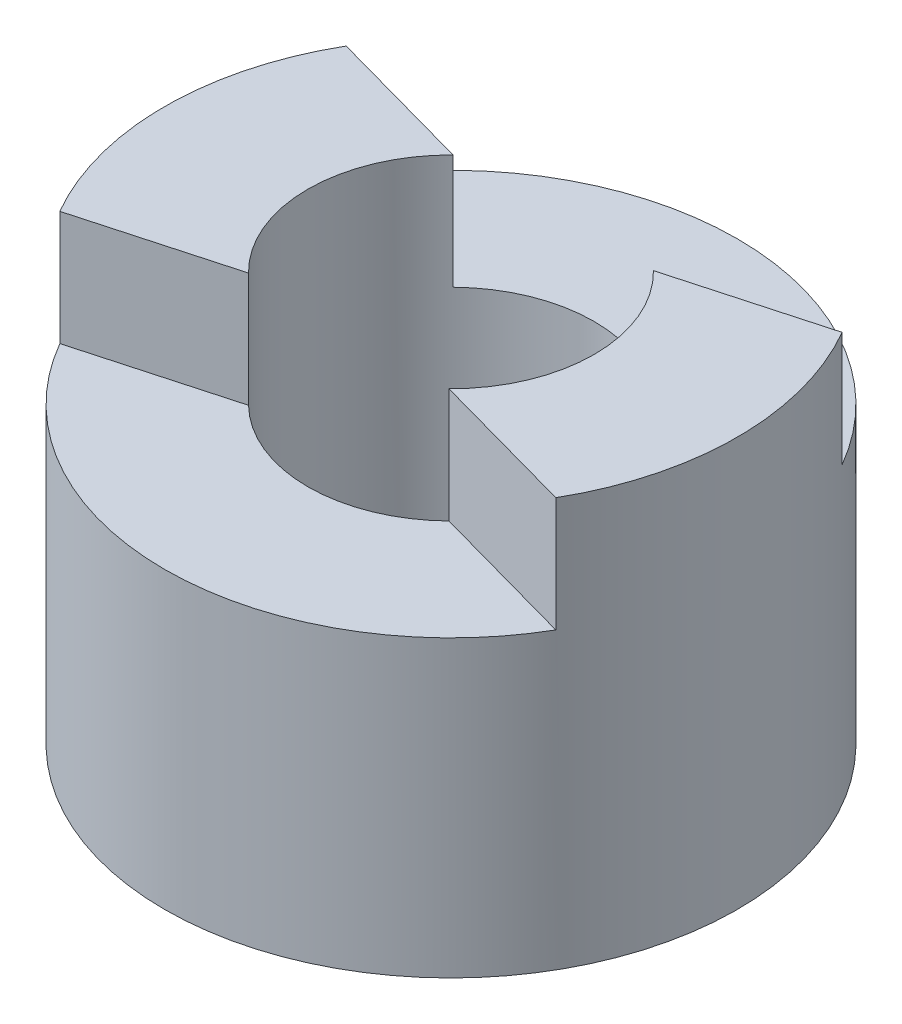
ISO-10303-21;
HEADER;
FILE_DESCRIPTION(('STEP AP214'),'2;1');
FILE_NAME('part.step','',(''),(''),'','','');
FILE_SCHEMA(('AUTOMOTIVE_DESIGN { 1 0 10303 214 1 1 1 1 }'));
ENDSEC;
DATA;
#1=APPLICATION_CONTEXT('core data for automotive mechanical design processes');
#2=APPLICATION_PROTOCOL_DEFINITION('international standard','automotive_design',2000,#1);
#3=PRODUCT_CONTEXT('',#1,'mechanical');
#4=PRODUCT('Part','Part','',(#3));
#5=PRODUCT_RELATED_PRODUCT_CATEGORY('part','',(#4));
#6=PRODUCT_DEFINITION_FORMATION('','',#4);
#7=PRODUCT_DEFINITION_CONTEXT('part definition',#1,'design');
#8=PRODUCT_DEFINITION('design','',#6,#7);
#9=PRODUCT_DEFINITION_SHAPE('','',#8);
#10=(LENGTH_UNIT() NAMED_UNIT(*) SI_UNIT(.MILLI.,.METRE.));
#11=(NAMED_UNIT(*) PLANE_ANGLE_UNIT() SI_UNIT($,.RADIAN.));
#12=(NAMED_UNIT(*) SI_UNIT($,.STERADIAN.) SOLID_ANGLE_UNIT());
#13=UNCERTAINTY_MEASURE_WITH_UNIT(LENGTH_MEASURE(1.E-05),#10,'distance_accuracy_value','');
#14=(GEOMETRIC_REPRESENTATION_CONTEXT(3) GLOBAL_UNCERTAINTY_ASSIGNED_CONTEXT((#13)) GLOBAL_UNIT_ASSIGNED_CONTEXT((#10,
#11,#12)) REPRESENTATION_CONTEXT('',''));
#15=CARTESIAN_POINT('',(0.,0.,0.));
#16=DIRECTION('',(0.,0.,1.));
#17=DIRECTION('',(1.,0.,0.));
#18=AXIS2_PLACEMENT_3D('',#15,#16,#17);
#19=CARTESIAN_POINT('',(0.,50.,0.));
#20=DIRECTION('',(0.,1.,0.));
#21=DIRECTION('',(0.,0.,1.));
#22=AXIS2_PLACEMENT_3D('',#19,#20,#21);
#23=PLANE('',#22);
#24=CARTESIAN_POINT('',(0.,50.,0.));
#25=DIRECTION('',(0.,1.,0.));
#26=DIRECTION('',(0.,0.,1.));
#27=AXIS2_PLACEMENT_3D('',#24,#25,#26);
#28=CIRCLE('',#27,17.5);
#29=CARTESIAN_POINT('',(-12.2474487139159,50.,-12.5));
#30=VERTEX_POINT('',#29);
#31=CARTESIAN_POINT('',(-12.2474487139159,50.,12.5));
#32=VERTEX_POINT('',#31);
#33=EDGE_CURVE('E117',#30,#32,#28,.T.);
#34=ORIENTED_EDGE('',*,*,#33,.F.);
#35=DIRECTION('',(-0.96375997924084,0.,-0.26677087999573));
#36=VECTOR('',#35,1.);
#37=CARTESIAN_POINT('',(-12.2474487139159,50.,-12.5));
#38=LINE('',#37,#36);
#39=CARTESIAN_POINT('',(-30.3108891324554,50.,-17.5));
#40=VERTEX_POINT('',#39);
#41=EDGE_CURVE('E105',#30,#40,#38,.T.);
#42=ORIENTED_EDGE('',*,*,#41,.T.);
#43=CARTESIAN_POINT('',(0.,50.,0.));
#44=DIRECTION('',(0.,1.,0.));
#45=DIRECTION('',(0.,0.,1.));
#46=AXIS2_PLACEMENT_3D('',#43,#44,#45);
#47=CIRCLE('',#46,35.);
#48=CARTESIAN_POINT('',(-30.3108891324554,50.,17.5));
#49=VERTEX_POINT('',#48);
#50=EDGE_CURVE('E44',#40,#49,#47,.T.);
#51=ORIENTED_EDGE('',*,*,#50,.T.);
#52=DIRECTION('',(-0.96375997924084,0.,0.26677087999573));
#53=VECTOR('',#52,1.);
#54=CARTESIAN_POINT('',(-12.2474487139159,50.,12.5));
#55=LINE('',#54,#53);
#56=EDGE_CURVE('E136',#32,#49,#55,.T.);
#57=ORIENTED_EDGE('',*,*,#56,.F.);
#58=EDGE_LOOP('',(#34,#42,#51,#57));
#59=FACE_BOUND('',#58,.T.);
#60=ADVANCED_FACE('F35',(#59),#23,.T.);
#61=CARTESIAN_POINT('',(30.3108891324554,50.,17.5));
#62=VERTEX_POINT('',#61);
#63=CARTESIAN_POINT('',(30.3108891324554,50.,-17.5));
#64=VERTEX_POINT('',#63);
#65=EDGE_CURVE('E12',#62,#64,#47,.T.);
#66=ORIENTED_EDGE('',*,*,#65,.T.);
#67=DIRECTION('',(-0.96375997924084,0.,0.266770879995729));
#68=VECTOR('',#67,1.);
#69=CARTESIAN_POINT('',(12.2474487139159,50.,-12.5));
#70=LINE('',#69,#68);
#71=CARTESIAN_POINT('',(12.2474487139159,50.,-12.5));
#72=VERTEX_POINT('',#71);
#73=EDGE_CURVE('E111',#64,#72,#70,.T.);
#74=ORIENTED_EDGE('',*,*,#73,.T.);
#75=CARTESIAN_POINT('',(12.2474487139159,50.,12.5));
#76=VERTEX_POINT('',#75);
#77=EDGE_CURVE('E124',#76,#72,#28,.T.);
#78=ORIENTED_EDGE('',*,*,#77,.F.);
#79=DIRECTION('',(-0.96375997924084,0.,-0.266770879995729));
#80=VECTOR('',#79,1.);
#81=CARTESIAN_POINT('',(12.2474487139159,50.,12.5));
#82=LINE('',#81,#80);
#83=EDGE_CURVE('E145',#62,#76,#82,.T.);
#84=ORIENTED_EDGE('',*,*,#83,.F.);
#85=EDGE_LOOP('',(#66,#74,#78,#84));
#86=FACE_BOUND('',#85,.T.);
#87=ADVANCED_FACE('F176',(#86),#23,.T.);
#88=CARTESIAN_POINT('',(0.,50.,0.));
#89=DIRECTION('',(0.,-1.,0.));
#90=DIRECTION('',(0.,0.,-1.));
#91=AXIS2_PLACEMENT_3D('',#88,#89,#90);
#92=CYLINDRICAL_SURFACE('',#91,35.);
#93=CARTESIAN_POINT('',(0.,0.,0.));
#94=DIRECTION('',(0.,1.,0.));
#95=DIRECTION('',(0.,0.,1.));
#96=AXIS2_PLACEMENT_3D('',#93,#94,#95);
#97=CIRCLE('',#96,35.);
#98=CARTESIAN_POINT('',(0.,0.,35.));
#99=VERTEX_POINT('',#98);
#100=EDGE_CURVE('E39',#99,#99,#97,.T.);
#101=ORIENTED_EDGE('',*,*,#100,.T.);
#102=EDGE_LOOP('',(#101));
#103=FACE_BOUND('',#102,.T.);
#104=DIRECTION('',(0.,1.,0.));
#105=VECTOR('',#104,1.);
#106=CARTESIAN_POINT('',(-30.3108891324554,-64.6625857818878,-17.5));
#107=LINE('',#106,#105);
#108=CARTESIAN_POINT('',(-30.3108891324554,36.,-17.5));
#109=VERTEX_POINT('',#108);
#110=EDGE_CURVE('E102',#109,#40,#107,.T.);
#111=ORIENTED_EDGE('',*,*,#110,.F.);
#112=CARTESIAN_POINT('',(0.,36.,0.));
#113=DIRECTION('',(0.,1.,0.));
#114=DIRECTION('',(0.,0.,1.));
#115=AXIS2_PLACEMENT_3D('',#112,#113,#114);
#116=CIRCLE('',#115,35.);
#117=CARTESIAN_POINT('',(30.3108891324554,36.,-17.5));
#118=VERTEX_POINT('',#117);
#119=EDGE_CURVE('E147',#118,#109,#116,.T.);
#120=ORIENTED_EDGE('',*,*,#119,.F.);
#121=DIRECTION('',(0.,1.,0.));
#122=VECTOR('',#121,1.);
#123=CARTESIAN_POINT('',(30.3108891324554,-64.6625857818878,-17.5));
#124=LINE('',#123,#122);
#125=EDGE_CURVE('E154',#118,#64,#124,.T.);
#126=ORIENTED_EDGE('',*,*,#125,.T.);
#127=ORIENTED_EDGE('',*,*,#65,.F.);
#128=DIRECTION('',(0.,1.,0.));
#129=VECTOR('',#128,1.);
#130=CARTESIAN_POINT('',(30.3108891324554,-64.6625857818878,17.5));
#131=LINE('',#130,#129);
#132=CARTESIAN_POINT('',(30.3108891324554,36.,17.5));
#133=VERTEX_POINT('',#132);
#134=EDGE_CURVE('E133',#133,#62,#131,.T.);
#135=ORIENTED_EDGE('',*,*,#134,.F.);
#136=CARTESIAN_POINT('',(0.,36.,0.));
#137=DIRECTION('',(0.,1.,0.));
#138=DIRECTION('',(0.,0.,1.));
#139=AXIS2_PLACEMENT_3D('',#136,#137,#138);
#140=CIRCLE('',#139,35.);
#141=CARTESIAN_POINT('',(-30.3108891324554,36.,17.5));
#142=VERTEX_POINT('',#141);
#143=EDGE_CURVE('E132',#133,#142,#140,.F.);
#144=ORIENTED_EDGE('',*,*,#143,.T.);
#145=DIRECTION('',(0.,1.,0.));
#146=VECTOR('',#145,1.);
#147=CARTESIAN_POINT('',(-30.3108891324554,-64.6625857818878,17.5));
#148=LINE('',#147,#146);
#149=EDGE_CURVE('E122',#142,#49,#148,.T.);
#150=ORIENTED_EDGE('',*,*,#149,.T.);
#151=ORIENTED_EDGE('',*,*,#50,.F.);
#152=EDGE_LOOP('',(#111,#120,#126,#127,#135,#144,#150,#151));
#153=FACE_BOUND('',#152,.T.);
#154=ADVANCED_FACE('F37',(#103,#153),#92,.T.);
#155=CARTESIAN_POINT('',(0.,50.,0.));
#156=DIRECTION('',(0.,-1.,0.));
#157=DIRECTION('',(0.,0.,-1.));
#158=AXIS2_PLACEMENT_3D('',#155,#156,#157);
#159=CYLINDRICAL_SURFACE('',#158,17.5);
#160=CARTESIAN_POINT('',(0.,0.,0.));
#161=DIRECTION('',(0.,1.,0.));
#162=DIRECTION('',(0.,0.,1.));
#163=AXIS2_PLACEMENT_3D('',#160,#161,#162);
#164=CIRCLE('',#163,17.5);
#165=CARTESIAN_POINT('',(0.,0.,17.5));
#166=VERTEX_POINT('',#165);
#167=EDGE_CURVE('E126',#166,#166,#164,.T.);
#168=ORIENTED_EDGE('',*,*,#167,.F.);
#169=EDGE_LOOP('',(#168));
#170=FACE_BOUND('',#169,.T.);
#171=CARTESIAN_POINT('',(0.,36.,0.));
#172=DIRECTION('',(0.,1.,0.));
#173=DIRECTION('',(0.,0.,1.));
#174=AXIS2_PLACEMENT_3D('',#171,#172,#173);
#175=CIRCLE('',#174,17.5);
#176=CARTESIAN_POINT('',(-12.2474487139159,36.,-12.5));
#177=VERTEX_POINT('',#176);
#178=CARTESIAN_POINT('',(12.2474487139159,36.,-12.5));
#179=VERTEX_POINT('',#178);
#180=EDGE_CURVE('E153',#177,#179,#175,.F.);
#181=ORIENTED_EDGE('',*,*,#180,.F.);
#182=DIRECTION('',(0.,1.,0.));
#183=VECTOR('',#182,1.);
#184=CARTESIAN_POINT('',(-12.2474487139159,-64.6625857818878,-12.5));
#185=LINE('',#184,#183);
#186=EDGE_CURVE('E110',#177,#30,#185,.T.);
#187=ORIENTED_EDGE('',*,*,#186,.T.);
#188=ORIENTED_EDGE('',*,*,#33,.T.);
#189=DIRECTION('',(0.,1.,0.));
#190=VECTOR('',#189,1.);
#191=CARTESIAN_POINT('',(-12.2474487139159,-64.6625857818878,12.5));
#192=LINE('',#191,#190);
#193=CARTESIAN_POINT('',(-12.2474487139159,36.,12.5));
#194=VERTEX_POINT('',#193);
#195=EDGE_CURVE('E139',#194,#32,#192,.T.);
#196=ORIENTED_EDGE('',*,*,#195,.F.);
#197=CARTESIAN_POINT('',(0.,36.,0.));
#198=DIRECTION('',(0.,1.,0.));
#199=DIRECTION('',(0.,0.,1.));
#200=AXIS2_PLACEMENT_3D('',#197,#198,#199);
#201=CIRCLE('',#200,17.5);
#202=CARTESIAN_POINT('',(12.2474487139159,36.,12.5));
#203=VERTEX_POINT('',#202);
#204=EDGE_CURVE('E143',#194,#203,#201,.T.);
#205=ORIENTED_EDGE('',*,*,#204,.T.);
#206=DIRECTION('',(0.,1.,0.));
#207=VECTOR('',#206,1.);
#208=CARTESIAN_POINT('',(12.2474487139159,-64.6625857818878,12.5));
#209=LINE('',#208,#207);
#210=EDGE_CURVE('E135',#203,#76,#209,.T.);
#211=ORIENTED_EDGE('',*,*,#210,.T.);
#212=ORIENTED_EDGE('',*,*,#77,.T.);
#213=DIRECTION('',(0.,1.,0.));
#214=VECTOR('',#213,1.);
#215=CARTESIAN_POINT('',(12.2474487139159,-64.6625857818878,-12.5));
#216=LINE('',#215,#214);
#217=EDGE_CURVE('E157',#179,#72,#216,.T.);
#218=ORIENTED_EDGE('',*,*,#217,.F.);
#219=EDGE_LOOP('',(#181,#187,#188,#196,#205,#211,#212,#218));
#220=FACE_BOUND('',#219,.T.);
#221=ADVANCED_FACE('F171',(#170,#220),#159,.F.);
#222=CARTESIAN_POINT('',(0.,0.,0.));
#223=DIRECTION('',(0.,1.,0.));
#224=DIRECTION('',(0.,0.,1.));
#225=AXIS2_PLACEMENT_3D('',#222,#223,#224);
#226=PLANE('',#225);
#227=ORIENTED_EDGE('',*,*,#100,.F.);
#228=EDGE_LOOP('',(#227));
#229=FACE_BOUND('',#228,.T.);
#230=ORIENTED_EDGE('',*,*,#167,.T.);
#231=EDGE_LOOP('',(#230));
#232=FACE_BOUND('',#231,.T.);
#233=ADVANCED_FACE('F187',(#229,#232),#226,.F.);
#234=CARTESIAN_POINT('',(-12.2474487139159,-64.6625857818878,12.5));
#235=DIRECTION('',(-0.26677087999573,0.,-0.96375997924084));
#236=DIRECTION('',(-0.96375997924084,0.,0.26677087999573));
#237=AXIS2_PLACEMENT_3D('',#234,#235,#236);
#238=PLANE('',#237);
#239=DIRECTION('',(0.96375997924084,0.,-0.26677087999573));
#240=VECTOR('',#239,1.);
#241=CARTESIAN_POINT('',(-12.2474487139159,36.,12.5));
#242=LINE('',#241,#240);
#243=EDGE_CURVE('E149',#142,#194,#242,.T.);
#244=ORIENTED_EDGE('',*,*,#243,.T.);
#245=ORIENTED_EDGE('',*,*,#195,.T.);
#246=ORIENTED_EDGE('',*,*,#56,.T.);
#247=ORIENTED_EDGE('',*,*,#149,.F.);
#248=EDGE_LOOP('',(#244,#245,#246,#247));
#249=FACE_BOUND('',#248,.T.);
#250=ADVANCED_FACE('F185',(#249),#238,.F.);
#251=CARTESIAN_POINT('',(12.2474487139159,-64.6625857818878,12.5));
#252=DIRECTION('',(0.266770879995729,0.,-0.96375997924084));
#253=DIRECTION('',(-0.96375997924084,0.,-0.266770879995729));
#254=AXIS2_PLACEMENT_3D('',#251,#252,#253);
#255=PLANE('',#254);
#256=DIRECTION('',(0.96375997924084,0.,0.266770879995729));
#257=VECTOR('',#256,1.);
#258=CARTESIAN_POINT('',(12.2474487139159,36.,12.5));
#259=LINE('',#258,#257);
#260=EDGE_CURVE('E59',#203,#133,#259,.T.);
#261=ORIENTED_EDGE('',*,*,#260,.T.);
#262=ORIENTED_EDGE('',*,*,#134,.T.);
#263=ORIENTED_EDGE('',*,*,#83,.T.);
#264=ORIENTED_EDGE('',*,*,#210,.F.);
#265=EDGE_LOOP('',(#261,#262,#263,#264));
#266=FACE_BOUND('',#265,.T.);
#267=ADVANCED_FACE('F181',(#266),#255,.F.);
#268=CARTESIAN_POINT('',(0.,36.,0.));
#269=DIRECTION('',(0.,1.,0.));
#270=DIRECTION('',(0.,0.,1.));
#271=AXIS2_PLACEMENT_3D('',#268,#269,#270);
#272=PLANE('',#271);
#273=ORIENTED_EDGE('',*,*,#143,.F.);
#274=ORIENTED_EDGE('',*,*,#260,.F.);
#275=ORIENTED_EDGE('',*,*,#204,.F.);
#276=ORIENTED_EDGE('',*,*,#243,.F.);
#277=EDGE_LOOP('',(#273,#274,#275,#276));
#278=FACE_BOUND('',#277,.T.);
#279=ADVANCED_FACE('F182',(#278),#272,.T.);
#280=CARTESIAN_POINT('',(-12.2474487139159,-64.6625857818878,-12.5));
#281=DIRECTION('',(0.26677087999573,0.,-0.96375997924084));
#282=DIRECTION('',(-0.96375997924084,0.,-0.26677087999573));
#283=AXIS2_PLACEMENT_3D('',#280,#281,#282);
#284=PLANE('',#283);
#285=ORIENTED_EDGE('',*,*,#110,.T.);
#286=ORIENTED_EDGE('',*,*,#41,.F.);
#287=ORIENTED_EDGE('',*,*,#186,.F.);
#288=DIRECTION('',(0.96375997924084,0.,0.26677087999573));
#289=VECTOR('',#288,1.);
#290=CARTESIAN_POINT('',(-12.2474487139159,36.,-12.5));
#291=LINE('',#290,#289);
#292=EDGE_CURVE('E51',#109,#177,#291,.T.);
#293=ORIENTED_EDGE('',*,*,#292,.F.);
#294=EDGE_LOOP('',(#285,#286,#287,#293));
#295=FACE_BOUND('',#294,.T.);
#296=ADVANCED_FACE('F104',(#295),#284,.T.);
#297=CARTESIAN_POINT('',(12.2474487139159,-64.6625857818878,-12.5));
#298=DIRECTION('',(-0.266770879995729,0.,-0.96375997924084));
#299=DIRECTION('',(-0.96375997924084,0.,0.266770879995729));
#300=AXIS2_PLACEMENT_3D('',#297,#298,#299);
#301=PLANE('',#300);
#302=ORIENTED_EDGE('',*,*,#217,.T.);
#303=ORIENTED_EDGE('',*,*,#73,.F.);
#304=ORIENTED_EDGE('',*,*,#125,.F.);
#305=DIRECTION('',(0.96375997924084,0.,-0.266770879995729));
#306=VECTOR('',#305,1.);
#307=CARTESIAN_POINT('',(12.2474487139159,36.,-12.5));
#308=LINE('',#307,#306);
#309=EDGE_CURVE('E164',#179,#118,#308,.T.);
#310=ORIENTED_EDGE('',*,*,#309,.F.);
#311=EDGE_LOOP('',(#302,#303,#304,#310));
#312=FACE_BOUND('',#311,.T.);
#313=ADVANCED_FACE('F174',(#312),#301,.T.);
#314=CARTESIAN_POINT('',(0.,36.,0.));
#315=DIRECTION('',(0.,1.,0.));
#316=DIRECTION('',(0.,0.,1.));
#317=AXIS2_PLACEMENT_3D('',#314,#315,#316);
#318=PLANE('',#317);
#319=ORIENTED_EDGE('',*,*,#309,.T.);
#320=ORIENTED_EDGE('',*,*,#119,.T.);
#321=ORIENTED_EDGE('',*,*,#292,.T.);
#322=ORIENTED_EDGE('',*,*,#180,.T.);
#323=EDGE_LOOP('',(#319,#320,#321,#322));
#324=FACE_BOUND('',#323,.T.);
#325=ADVANCED_FACE('F169',(#324),#318,.T.);
#326=CLOSED_SHELL('',(#60,#87,#154,#221,#233,#250,#267,#279,#296,#313,#325));
#327=MANIFOLD_SOLID_BREP('B2',#326);
#328=ADVANCED_BREP_SHAPE_REPRESENTATION('',(#18,#327),#14);
#329=SHAPE_DEFINITION_REPRESENTATION(#9,#328);
ENDSEC;
END-ISO-10303-21;
